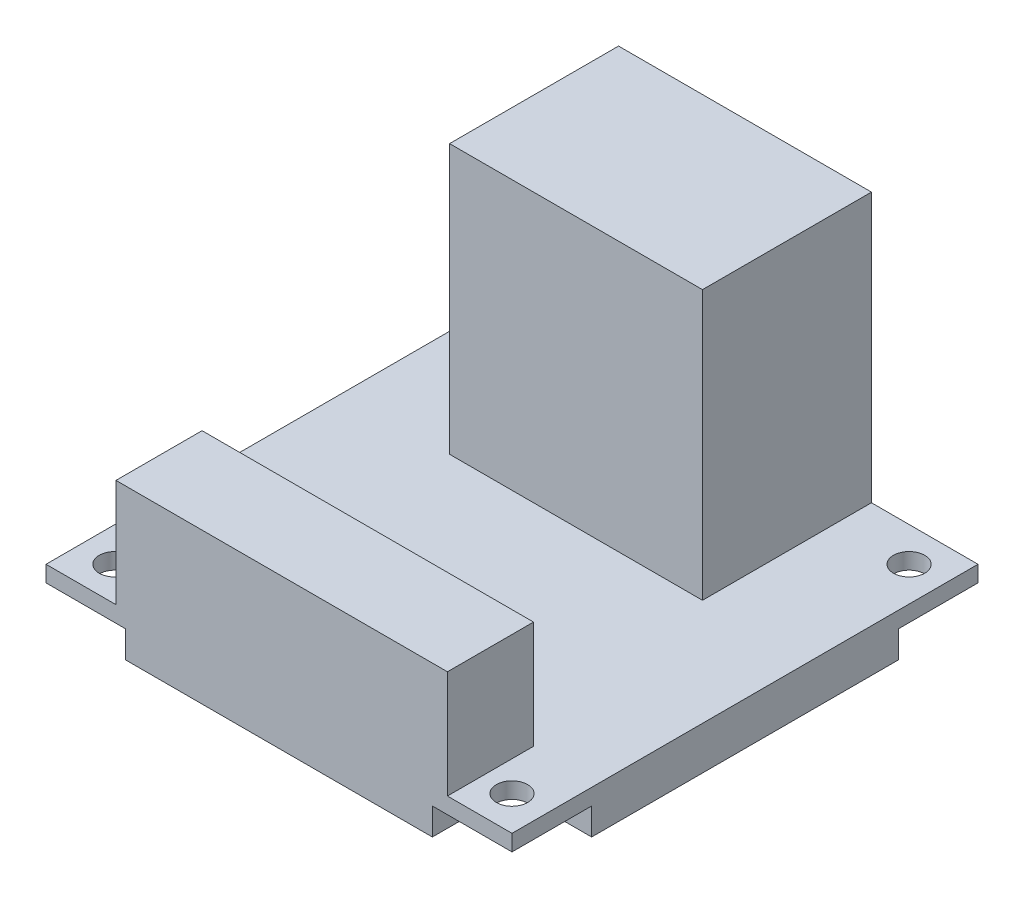
ISO-10303-21;
HEADER;
FILE_DESCRIPTION(('STEP AP214'),'2;1');
FILE_NAME('part.step','',(''),(''),'','','');
FILE_SCHEMA(('AUTOMOTIVE_DESIGN { 1 0 10303 214 1 1 1 1 }'));
ENDSEC;
DATA;
#1=APPLICATION_CONTEXT('core data for automotive mechanical design processes');
#2=APPLICATION_PROTOCOL_DEFINITION('international standard','automotive_design',2000,#1);
#3=PRODUCT_CONTEXT('',#1,'mechanical');
#4=PRODUCT('Part','Part','',(#3));
#5=PRODUCT_RELATED_PRODUCT_CATEGORY('part','',(#4));
#6=PRODUCT_DEFINITION_FORMATION('','',#4);
#7=PRODUCT_DEFINITION_CONTEXT('part definition',#1,'design');
#8=PRODUCT_DEFINITION('design','',#6,#7);
#9=PRODUCT_DEFINITION_SHAPE('','',#8);
#10=(LENGTH_UNIT() NAMED_UNIT(*) SI_UNIT(.MILLI.,.METRE.));
#11=(NAMED_UNIT(*) PLANE_ANGLE_UNIT() SI_UNIT($,.RADIAN.));
#12=(NAMED_UNIT(*) SI_UNIT($,.STERADIAN.) SOLID_ANGLE_UNIT());
#13=UNCERTAINTY_MEASURE_WITH_UNIT(LENGTH_MEASURE(1.E-05),#10,'distance_accuracy_value','');
#14=(GEOMETRIC_REPRESENTATION_CONTEXT(3) GLOBAL_UNCERTAINTY_ASSIGNED_CONTEXT((#13)) GLOBAL_UNIT_ASSIGNED_CONTEXT((#10,
#11,#12)) REPRESENTATION_CONTEXT('',''));
#15=CARTESIAN_POINT('',(0.,0.,0.));
#16=DIRECTION('',(0.,0.,1.));
#17=DIRECTION('',(1.,0.,0.));
#18=AXIS2_PLACEMENT_3D('',#15,#16,#17);
#19=CARTESIAN_POINT('',(0.,1.5,0.));
#20=DIRECTION('',(0.,-1.,0.));
#21=DIRECTION('',(0.,0.,-1.));
#22=AXIS2_PLACEMENT_3D('',#19,#20,#21);
#23=PLANE('',#22);
#24=CARTESIAN_POINT('',(3.2,1.5,-3.2));
#25=DIRECTION('',(0.,1.,0.));
#26=DIRECTION('',(0.,0.,1.));
#27=AXIS2_PLACEMENT_3D('',#24,#25,#26);
#28=CIRCLE('',#27,1.45);
#29=CARTESIAN_POINT('',(3.2,1.5,-1.75));
#30=VERTEX_POINT('',#29);
#31=EDGE_CURVE('E359',#30,#30,#28,.T.);
#32=ORIENTED_EDGE('',*,*,#31,.F.);
#33=EDGE_LOOP('',(#32));
#34=FACE_BOUND('',#33,.T.);
#35=CARTESIAN_POINT('',(3.2,1.5,-40.1));
#36=DIRECTION('',(0.,1.,0.));
#37=DIRECTION('',(0.,0.,1.));
#38=AXIS2_PLACEMENT_3D('',#35,#36,#37);
#39=CIRCLE('',#38,1.45);
#40=CARTESIAN_POINT('',(3.2,1.5,-38.65));
#41=VERTEX_POINT('',#40);
#42=EDGE_CURVE('E353',#41,#41,#39,.T.);
#43=ORIENTED_EDGE('',*,*,#42,.F.);
#44=EDGE_LOOP('',(#43));
#45=FACE_BOUND('',#44,.T.);
#46=CARTESIAN_POINT('',(40.1,1.5,-40.1));
#47=DIRECTION('',(0.,1.,0.));
#48=DIRECTION('',(0.,0.,1.));
#49=AXIS2_PLACEMENT_3D('',#46,#47,#48);
#50=CIRCLE('',#49,1.45);
#51=CARTESIAN_POINT('',(40.1,1.5,-38.65));
#52=VERTEX_POINT('',#51);
#53=EDGE_CURVE('E347',#52,#52,#50,.T.);
#54=ORIENTED_EDGE('',*,*,#53,.F.);
#55=EDGE_LOOP('',(#54));
#56=FACE_BOUND('',#55,.T.);
#57=CARTESIAN_POINT('',(40.1,1.5,-3.2));
#58=DIRECTION('',(0.,1.,0.));
#59=DIRECTION('',(0.,0.,1.));
#60=AXIS2_PLACEMENT_3D('',#57,#58,#59);
#61=CIRCLE('',#60,1.45);
#62=CARTESIAN_POINT('',(40.1,1.5,-1.75));
#63=VERTEX_POINT('',#62);
#64=EDGE_CURVE('E341',#63,#63,#61,.T.);
#65=ORIENTED_EDGE('',*,*,#64,.F.);
#66=EDGE_LOOP('',(#65));
#67=FACE_BOUND('',#66,.T.);
#68=DIRECTION('',(0.,0.,-1.));
#69=VECTOR('',#68,1.);
#70=CARTESIAN_POINT('',(33.4,1.5,-43.3));
#71=LINE('',#70,#69);
#72=CARTESIAN_POINT('',(33.4,1.5,-27.6));
#73=VERTEX_POINT('',#72);
#74=CARTESIAN_POINT('',(33.4,1.5,-43.3));
#75=VERTEX_POINT('',#74);
#76=EDGE_CURVE('E52',#73,#75,#71,.T.);
#77=ORIENTED_EDGE('',*,*,#76,.F.);
#78=DIRECTION('',(1.,0.,0.));
#79=VECTOR('',#78,1.);
#80=CARTESIAN_POINT('',(33.4,1.5,-27.6));
#81=LINE('',#80,#79);
#82=CARTESIAN_POINT('',(9.9,1.5,-27.6));
#83=VERTEX_POINT('',#82);
#84=EDGE_CURVE('E56',#83,#73,#81,.T.);
#85=ORIENTED_EDGE('',*,*,#84,.F.);
#86=DIRECTION('',(0.,0.,1.));
#87=VECTOR('',#86,1.);
#88=CARTESIAN_POINT('',(9.9,1.5,-43.3));
#89=LINE('',#88,#87);
#90=CARTESIAN_POINT('',(9.9,1.5,-43.3));
#91=VERTEX_POINT('',#90);
#92=EDGE_CURVE('E508',#91,#83,#89,.T.);
#93=ORIENTED_EDGE('',*,*,#92,.F.);
#94=DIRECTION('',(-1.,0.,0.));
#95=VECTOR('',#94,1.);
#96=CARTESIAN_POINT('',(0.,1.5,-43.3));
#97=LINE('',#96,#95);
#98=CARTESIAN_POINT('',(0.,1.5,-43.3));
#99=VERTEX_POINT('',#98);
#100=EDGE_CURVE('E374',#91,#99,#97,.T.);
#101=ORIENTED_EDGE('',*,*,#100,.T.);
#102=DIRECTION('',(0.,0.,1.));
#103=VECTOR('',#102,1.);
#104=CARTESIAN_POINT('',(0.,1.5,0.));
#105=LINE('',#104,#103);
#106=CARTESIAN_POINT('',(0.,1.5,0.));
#107=VERTEX_POINT('',#106);
#108=EDGE_CURVE('E365',#99,#107,#105,.T.);
#109=ORIENTED_EDGE('',*,*,#108,.T.);
#110=DIRECTION('',(1.,0.,0.));
#111=VECTOR('',#110,1.);
#112=CARTESIAN_POINT('',(0.,1.5,0.));
#113=LINE('',#112,#111);
#114=CARTESIAN_POINT('',(6.5,1.5,0.));
#115=VERTEX_POINT('',#114);
#116=EDGE_CURVE('E370',#107,#115,#113,.T.);
#117=ORIENTED_EDGE('',*,*,#116,.T.);
#118=DIRECTION('',(0.,0.,1.));
#119=VECTOR('',#118,1.);
#120=CARTESIAN_POINT('',(6.5,1.5,0.));
#121=LINE('',#120,#119);
#122=CARTESIAN_POINT('',(6.5,1.5,-8.));
#123=VERTEX_POINT('',#122);
#124=EDGE_CURVE('E220',#123,#115,#121,.T.);
#125=ORIENTED_EDGE('',*,*,#124,.F.);
#126=DIRECTION('',(-1.,0.,0.));
#127=VECTOR('',#126,1.);
#128=CARTESIAN_POINT('',(6.5,1.5,-8.));
#129=LINE('',#128,#127);
#130=CARTESIAN_POINT('',(37.3,1.5,-8.));
#131=VERTEX_POINT('',#130);
#132=EDGE_CURVE('E233',#131,#123,#129,.T.);
#133=ORIENTED_EDGE('',*,*,#132,.F.);
#134=DIRECTION('',(0.,0.,-1.));
#135=VECTOR('',#134,1.);
#136=CARTESIAN_POINT('',(37.3,1.5,0.));
#137=LINE('',#136,#135);
#138=CARTESIAN_POINT('',(37.3,1.5,0.));
#139=VERTEX_POINT('',#138);
#140=EDGE_CURVE('E223',#139,#131,#137,.T.);
#141=ORIENTED_EDGE('',*,*,#140,.F.);
#142=CARTESIAN_POINT('',(43.3,1.5,0.));
#143=VERTEX_POINT('',#142);
#144=EDGE_CURVE('E368',#139,#143,#113,.T.);
#145=ORIENTED_EDGE('',*,*,#144,.T.);
#146=DIRECTION('',(0.,0.,-1.));
#147=VECTOR('',#146,1.);
#148=CARTESIAN_POINT('',(43.3,1.5,0.));
#149=LINE('',#148,#147);
#150=CARTESIAN_POINT('',(43.3,1.5,-43.3));
#151=VERTEX_POINT('',#150);
#152=EDGE_CURVE('E372',#143,#151,#149,.T.);
#153=ORIENTED_EDGE('',*,*,#152,.T.);
#154=EDGE_CURVE('E375',#151,#75,#97,.T.);
#155=ORIENTED_EDGE('',*,*,#154,.T.);
#156=EDGE_LOOP('',(#77,#85,#93,#101,#109,#117,#125,#133,#141,#145,#153,#155));
#157=FACE_BOUND('',#156,.T.);
#158=ADVANCED_FACE('F37',(#34,#45,#56,#67,#157),#23,.F.);
#159=CARTESIAN_POINT('',(0.,0.,0.));
#160=DIRECTION('',(0.,-1.,0.));
#161=DIRECTION('',(0.,0.,-1.));
#162=AXIS2_PLACEMENT_3D('',#159,#160,#161);
#163=PLANE('',#162);
#164=DIRECTION('',(-1.,0.,0.));
#165=VECTOR('',#164,1.);
#166=CARTESIAN_POINT('',(0.,0.,-7.4));
#167=LINE('',#166,#165);
#168=CARTESIAN_POINT('',(7.4,0.,-7.4));
#169=VERTEX_POINT('',#168);
#170=CARTESIAN_POINT('',(0.,0.,-7.4));
#171=VERTEX_POINT('',#170);
#172=EDGE_CURVE('E260',#169,#171,#167,.T.);
#173=ORIENTED_EDGE('',*,*,#172,.F.);
#174=DIRECTION('',(0.,0.,-1.));
#175=VECTOR('',#174,1.);
#176=CARTESIAN_POINT('',(7.4,0.,-7.4));
#177=LINE('',#176,#175);
#178=CARTESIAN_POINT('',(7.4,0.,0.));
#179=VERTEX_POINT('',#178);
#180=EDGE_CURVE('E300',#179,#169,#177,.T.);
#181=ORIENTED_EDGE('',*,*,#180,.F.);
#182=DIRECTION('',(1.,0.,0.));
#183=VECTOR('',#182,1.);
#184=CARTESIAN_POINT('',(0.,0.,0.));
#185=LINE('',#184,#183);
#186=CARTESIAN_POINT('',(0.,0.,0.));
#187=VERTEX_POINT('',#186);
#188=EDGE_CURVE('E382',#187,#179,#185,.T.);
#189=ORIENTED_EDGE('',*,*,#188,.F.);
#190=DIRECTION('',(0.,0.,1.));
#191=VECTOR('',#190,1.);
#192=CARTESIAN_POINT('',(0.,0.,0.));
#193=LINE('',#192,#191);
#194=EDGE_CURVE('E362',#171,#187,#193,.T.);
#195=ORIENTED_EDGE('',*,*,#194,.F.);
#196=EDGE_LOOP('',(#173,#181,#189,#195));
#197=FACE_BOUND('',#196,.T.);
#198=CARTESIAN_POINT('',(3.2,0.,-3.2));
#199=DIRECTION('',(0.,1.,0.));
#200=DIRECTION('',(0.,0.,1.));
#201=AXIS2_PLACEMENT_3D('',#198,#199,#200);
#202=CIRCLE('',#201,1.45);
#203=CARTESIAN_POINT('',(3.2,0.,-1.75));
#204=VERTEX_POINT('',#203);
#205=EDGE_CURVE('E356',#204,#204,#202,.T.);
#206=ORIENTED_EDGE('',*,*,#205,.T.);
#207=EDGE_LOOP('',(#206));
#208=FACE_BOUND('',#207,.T.);
#209=ADVANCED_FACE('F460',(#197,#208),#163,.T.);
#210=DIRECTION('',(0.,0.,1.));
#211=VECTOR('',#210,1.);
#212=CARTESIAN_POINT('',(35.9,0.,0.));
#213=LINE('',#212,#211);
#214=CARTESIAN_POINT('',(35.9,0.,-7.4));
#215=VERTEX_POINT('',#214);
#216=CARTESIAN_POINT('',(35.9,0.,0.));
#217=VERTEX_POINT('',#216);
#218=EDGE_CURVE('E297',#215,#217,#213,.T.);
#219=ORIENTED_EDGE('',*,*,#218,.F.);
#220=DIRECTION('',(-1.,0.,0.));
#221=VECTOR('',#220,1.);
#222=CARTESIAN_POINT('',(35.9,0.,-7.4));
#223=LINE('',#222,#221);
#224=CARTESIAN_POINT('',(43.3,0.,-7.4));
#225=VERTEX_POINT('',#224);
#226=EDGE_CURVE('E294',#225,#215,#223,.T.);
#227=ORIENTED_EDGE('',*,*,#226,.F.);
#228=DIRECTION('',(0.,0.,-1.));
#229=VECTOR('',#228,1.);
#230=CARTESIAN_POINT('',(43.3,0.,0.));
#231=LINE('',#230,#229);
#232=CARTESIAN_POINT('',(43.3,0.,0.));
#233=VERTEX_POINT('',#232);
#234=EDGE_CURVE('E386',#233,#225,#231,.T.);
#235=ORIENTED_EDGE('',*,*,#234,.F.);
#236=EDGE_CURVE('E381',#217,#233,#185,.T.);
#237=ORIENTED_EDGE('',*,*,#236,.F.);
#238=EDGE_LOOP('',(#219,#227,#235,#237));
#239=FACE_BOUND('',#238,.T.);
#240=CARTESIAN_POINT('',(40.1,0.,-3.2));
#241=DIRECTION('',(0.,1.,0.));
#242=DIRECTION('',(0.,0.,1.));
#243=AXIS2_PLACEMENT_3D('',#240,#241,#242);
#244=CIRCLE('',#243,1.45);
#245=CARTESIAN_POINT('',(40.1,0.,-1.75));
#246=VERTEX_POINT('',#245);
#247=EDGE_CURVE('E340',#246,#246,#244,.T.);
#248=ORIENTED_EDGE('',*,*,#247,.T.);
#249=EDGE_LOOP('',(#248));
#250=FACE_BOUND('',#249,.T.);
#251=ADVANCED_FACE('F406',(#239,#250),#163,.T.);
#252=DIRECTION('',(1.,0.,0.));
#253=VECTOR('',#252,1.);
#254=CARTESIAN_POINT('',(43.3,0.,-35.9));
#255=LINE('',#254,#253);
#256=CARTESIAN_POINT('',(35.9,0.,-35.9));
#257=VERTEX_POINT('',#256);
#258=CARTESIAN_POINT('',(43.3,0.,-35.9));
#259=VERTEX_POINT('',#258);
#260=EDGE_CURVE('E291',#257,#259,#255,.T.);
#261=ORIENTED_EDGE('',*,*,#260,.F.);
#262=DIRECTION('',(0.,0.,1.));
#263=VECTOR('',#262,1.);
#264=CARTESIAN_POINT('',(35.9,0.,-35.9));
#265=LINE('',#264,#263);
#266=CARTESIAN_POINT('',(35.9,0.,-43.3));
#267=VERTEX_POINT('',#266);
#268=EDGE_CURVE('E288',#267,#257,#265,.T.);
#269=ORIENTED_EDGE('',*,*,#268,.F.);
#270=DIRECTION('',(-1.,0.,0.));
#271=VECTOR('',#270,1.);
#272=CARTESIAN_POINT('',(0.,0.,-43.3));
#273=LINE('',#272,#271);
#274=CARTESIAN_POINT('',(43.3,0.,-43.3));
#275=VERTEX_POINT('',#274);
#276=EDGE_CURVE('E369',#275,#267,#273,.T.);
#277=ORIENTED_EDGE('',*,*,#276,.F.);
#278=EDGE_CURVE('E385',#259,#275,#231,.T.);
#279=ORIENTED_EDGE('',*,*,#278,.F.);
#280=EDGE_LOOP('',(#261,#269,#277,#279));
#281=FACE_BOUND('',#280,.T.);
#282=CARTESIAN_POINT('',(40.1,0.,-40.1));
#283=DIRECTION('',(0.,1.,0.));
#284=DIRECTION('',(0.,0.,1.));
#285=AXIS2_PLACEMENT_3D('',#282,#283,#284);
#286=CIRCLE('',#285,1.45);
#287=CARTESIAN_POINT('',(40.1,0.,-38.65));
#288=VERTEX_POINT('',#287);
#289=EDGE_CURVE('E344',#288,#288,#286,.T.);
#290=ORIENTED_EDGE('',*,*,#289,.T.);
#291=EDGE_LOOP('',(#290));
#292=FACE_BOUND('',#291,.T.);
#293=ADVANCED_FACE('F427',(#281,#292),#163,.T.);
#294=DIRECTION('',(1.,0.,0.));
#295=VECTOR('',#294,1.);
#296=CARTESIAN_POINT('',(7.4,0.,-35.9));
#297=LINE('',#296,#295);
#298=CARTESIAN_POINT('',(0.,0.,-35.9));
#299=VERTEX_POINT('',#298);
#300=CARTESIAN_POINT('',(7.4,0.,-35.9));
#301=VERTEX_POINT('',#300);
#302=EDGE_CURVE('E255',#299,#301,#297,.T.);
#303=ORIENTED_EDGE('',*,*,#302,.F.);
#304=CARTESIAN_POINT('',(0.,0.,-43.3));
#305=VERTEX_POINT('',#304);
#306=EDGE_CURVE('E378',#305,#299,#193,.T.);
#307=ORIENTED_EDGE('',*,*,#306,.F.);
#308=CARTESIAN_POINT('',(7.4,0.,-43.3));
#309=VERTEX_POINT('',#308);
#310=EDGE_CURVE('E389',#309,#305,#273,.T.);
#311=ORIENTED_EDGE('',*,*,#310,.F.);
#312=DIRECTION('',(0.,0.,-1.));
#313=VECTOR('',#312,1.);
#314=CARTESIAN_POINT('',(7.4,0.,-43.3));
#315=LINE('',#314,#313);
#316=EDGE_CURVE('E285',#301,#309,#315,.T.);
#317=ORIENTED_EDGE('',*,*,#316,.F.);
#318=EDGE_LOOP('',(#303,#307,#311,#317));
#319=FACE_BOUND('',#318,.T.);
#320=CARTESIAN_POINT('',(3.2,0.,-40.1));
#321=DIRECTION('',(0.,1.,0.));
#322=DIRECTION('',(0.,0.,1.));
#323=AXIS2_PLACEMENT_3D('',#320,#321,#322);
#324=CIRCLE('',#323,1.45);
#325=CARTESIAN_POINT('',(3.2,0.,-38.65));
#326=VERTEX_POINT('',#325);
#327=EDGE_CURVE('E350',#326,#326,#324,.T.);
#328=ORIENTED_EDGE('',*,*,#327,.T.);
#329=EDGE_LOOP('',(#328));
#330=FACE_BOUND('',#329,.T.);
#331=ADVANCED_FACE('F468',(#319,#330),#163,.T.);
#332=CARTESIAN_POINT('',(0.,1.5,0.));
#333=DIRECTION('',(1.,0.,0.));
#334=DIRECTION('',(0.,0.,-1.));
#335=AXIS2_PLACEMENT_3D('',#332,#333,#334);
#336=PLANE('',#335);
#337=ORIENTED_EDGE('',*,*,#306,.T.);
#338=DIRECTION('',(0.,1.,0.));
#339=VECTOR('',#338,1.);
#340=CARTESIAN_POINT('',(0.,-2.5,-35.9));
#341=LINE('',#340,#339);
#342=CARTESIAN_POINT('',(0.,-2.5,-35.9));
#343=VERTEX_POINT('',#342);
#344=EDGE_CURVE('E282',#343,#299,#341,.T.);
#345=ORIENTED_EDGE('',*,*,#344,.F.);
#346=DIRECTION('',(0.,0.,-1.));
#347=VECTOR('',#346,1.);
#348=CARTESIAN_POINT('',(0.,-2.5,-35.9));
#349=LINE('',#348,#347);
#350=CARTESIAN_POINT('',(0.,-2.5,-7.4));
#351=VERTEX_POINT('',#350);
#352=EDGE_CURVE('E280',#351,#343,#349,.T.);
#353=ORIENTED_EDGE('',*,*,#352,.F.);
#354=DIRECTION('',(0.,1.,0.));
#355=VECTOR('',#354,1.);
#356=CARTESIAN_POINT('',(0.,-2.5,-7.4));
#357=LINE('',#356,#355);
#358=EDGE_CURVE('E307',#351,#171,#357,.T.);
#359=ORIENTED_EDGE('',*,*,#358,.T.);
#360=ORIENTED_EDGE('',*,*,#194,.T.);
#361=DIRECTION('',(0.,-1.,0.));
#362=VECTOR('',#361,1.);
#363=CARTESIAN_POINT('',(0.,1.5,0.));
#364=LINE('',#363,#362);
#365=EDGE_CURVE('E11',#107,#187,#364,.T.);
#366=ORIENTED_EDGE('',*,*,#365,.F.);
#367=ORIENTED_EDGE('',*,*,#108,.F.);
#368=DIRECTION('',(0.,-1.,0.));
#369=VECTOR('',#368,1.);
#370=CARTESIAN_POINT('',(0.,1.5,-43.3));
#371=LINE('',#370,#369);
#372=EDGE_CURVE('E377',#99,#305,#371,.T.);
#373=ORIENTED_EDGE('',*,*,#372,.T.);
#374=EDGE_LOOP('',(#337,#345,#353,#359,#360,#366,#367,#373));
#375=FACE_BOUND('',#374,.T.);
#376=ADVANCED_FACE('F39',(#375),#336,.F.);
#377=CARTESIAN_POINT('',(0.,1.5,0.));
#378=DIRECTION('',(0.,0.,-1.));
#379=DIRECTION('',(-1.,0.,0.));
#380=AXIS2_PLACEMENT_3D('',#377,#378,#379);
#381=PLANE('',#380);
#382=ORIENTED_EDGE('',*,*,#188,.T.);
#383=DIRECTION('',(0.,1.,0.));
#384=VECTOR('',#383,1.);
#385=CARTESIAN_POINT('',(7.4,-2.5,0.));
#386=LINE('',#385,#384);
#387=CARTESIAN_POINT('',(7.4,-2.5,0.));
#388=VERTEX_POINT('',#387);
#389=EDGE_CURVE('E313',#388,#179,#386,.T.);
#390=ORIENTED_EDGE('',*,*,#389,.F.);
#391=DIRECTION('',(-1.,0.,0.));
#392=VECTOR('',#391,1.);
#393=CARTESIAN_POINT('',(7.4,-2.5,0.));
#394=LINE('',#393,#392);
#395=CARTESIAN_POINT('',(35.9,-2.5,0.));
#396=VERTEX_POINT('',#395);
#397=EDGE_CURVE('E274',#396,#388,#394,.T.);
#398=ORIENTED_EDGE('',*,*,#397,.F.);
#399=DIRECTION('',(0.,1.,0.));
#400=VECTOR('',#399,1.);
#401=CARTESIAN_POINT('',(35.9,-2.5,0.));
#402=LINE('',#401,#400);
#403=EDGE_CURVE('E316',#396,#217,#402,.T.);
#404=ORIENTED_EDGE('',*,*,#403,.T.);
#405=ORIENTED_EDGE('',*,*,#236,.T.);
#406=DIRECTION('',(0.,-1.,0.));
#407=VECTOR('',#406,1.);
#408=CARTESIAN_POINT('',(43.3,1.5,0.));
#409=LINE('',#408,#407);
#410=EDGE_CURVE('E45',#143,#233,#409,.T.);
#411=ORIENTED_EDGE('',*,*,#410,.F.);
#412=ORIENTED_EDGE('',*,*,#144,.F.);
#413=DIRECTION('',(0.,-1.,0.));
#414=VECTOR('',#413,1.);
#415=CARTESIAN_POINT('',(37.3,11.5,0.));
#416=LINE('',#415,#414);
#417=CARTESIAN_POINT('',(37.3,11.5,0.));
#418=VERTEX_POINT('',#417);
#419=EDGE_CURVE('E249',#418,#139,#416,.T.);
#420=ORIENTED_EDGE('',*,*,#419,.F.);
#421=DIRECTION('',(1.,0.,0.));
#422=VECTOR('',#421,1.);
#423=CARTESIAN_POINT('',(6.5,11.5,0.));
#424=LINE('',#423,#422);
#425=CARTESIAN_POINT('',(6.5,11.5,0.));
#426=VERTEX_POINT('',#425);
#427=EDGE_CURVE('E232',#426,#418,#424,.T.);
#428=ORIENTED_EDGE('',*,*,#427,.F.);
#429=DIRECTION('',(0.,-1.,0.));
#430=VECTOR('',#429,1.);
#431=CARTESIAN_POINT('',(6.5,11.5,0.));
#432=LINE('',#431,#430);
#433=EDGE_CURVE('E252',#426,#115,#432,.T.);
#434=ORIENTED_EDGE('',*,*,#433,.T.);
#435=ORIENTED_EDGE('',*,*,#116,.F.);
#436=ORIENTED_EDGE('',*,*,#365,.T.);
#437=EDGE_LOOP('',(#382,#390,#398,#404,#405,#411,#412,#420,#428,#434,#435,#436));
#438=FACE_BOUND('',#437,.T.);
#439=ADVANCED_FACE('F436',(#438),#381,.F.);
#440=CARTESIAN_POINT('',(43.3,1.5,0.));
#441=DIRECTION('',(-1.,0.,0.));
#442=DIRECTION('',(0.,0.,1.));
#443=AXIS2_PLACEMENT_3D('',#440,#441,#442);
#444=PLANE('',#443);
#445=ORIENTED_EDGE('',*,*,#234,.T.);
#446=DIRECTION('',(0.,1.,0.));
#447=VECTOR('',#446,1.);
#448=CARTESIAN_POINT('',(43.3,-2.5,-7.4));
#449=LINE('',#448,#447);
#450=CARTESIAN_POINT('',(43.3,-2.5,-7.4));
#451=VERTEX_POINT('',#450);
#452=EDGE_CURVE('E322',#451,#225,#449,.T.);
#453=ORIENTED_EDGE('',*,*,#452,.F.);
#454=DIRECTION('',(0.,0.,1.));
#455=VECTOR('',#454,1.);
#456=CARTESIAN_POINT('',(43.3,-2.5,-7.4));
#457=LINE('',#456,#455);
#458=CARTESIAN_POINT('',(43.3,-2.5,-35.9));
#459=VERTEX_POINT('',#458);
#460=EDGE_CURVE('E268',#459,#451,#457,.T.);
#461=ORIENTED_EDGE('',*,*,#460,.F.);
#462=DIRECTION('',(0.,1.,0.));
#463=VECTOR('',#462,1.);
#464=CARTESIAN_POINT('',(43.3,-2.5,-35.9));
#465=LINE('',#464,#463);
#466=EDGE_CURVE('E325',#459,#259,#465,.T.);
#467=ORIENTED_EDGE('',*,*,#466,.T.);
#468=ORIENTED_EDGE('',*,*,#278,.T.);
#469=DIRECTION('',(0.,-1.,0.));
#470=VECTOR('',#469,1.);
#471=CARTESIAN_POINT('',(43.3,1.5,-43.3));
#472=LINE('',#471,#470);
#473=EDGE_CURVE('E393',#151,#275,#472,.T.);
#474=ORIENTED_EDGE('',*,*,#473,.F.);
#475=ORIENTED_EDGE('',*,*,#152,.F.);
#476=ORIENTED_EDGE('',*,*,#410,.T.);
#477=EDGE_LOOP('',(#445,#453,#461,#467,#468,#474,#475,#476));
#478=FACE_BOUND('',#477,.T.);
#479=ADVANCED_FACE('F400',(#478),#444,.F.);
#480=CARTESIAN_POINT('',(0.,1.5,-43.3));
#481=DIRECTION('',(0.,0.,1.));
#482=DIRECTION('',(1.,0.,0.));
#483=AXIS2_PLACEMENT_3D('',#480,#481,#482);
#484=PLANE('',#483);
#485=ORIENTED_EDGE('',*,*,#276,.T.);
#486=DIRECTION('',(0.,1.,0.));
#487=VECTOR('',#486,1.);
#488=CARTESIAN_POINT('',(35.9,-2.5,-43.3));
#489=LINE('',#488,#487);
#490=CARTESIAN_POINT('',(35.9,-2.5,-43.3));
#491=VERTEX_POINT('',#490);
#492=EDGE_CURVE('E331',#491,#267,#489,.T.);
#493=ORIENTED_EDGE('',*,*,#492,.F.);
#494=DIRECTION('',(1.,0.,0.));
#495=VECTOR('',#494,1.);
#496=CARTESIAN_POINT('',(35.9,-2.5,-43.3));
#497=LINE('',#496,#495);
#498=CARTESIAN_POINT('',(7.4,-2.5,-43.3));
#499=VERTEX_POINT('',#498);
#500=EDGE_CURVE('E262',#499,#491,#497,.T.);
#501=ORIENTED_EDGE('',*,*,#500,.F.);
#502=DIRECTION('',(0.,1.,0.));
#503=VECTOR('',#502,1.);
#504=CARTESIAN_POINT('',(7.4,-2.5,-43.3));
#505=LINE('',#504,#503);
#506=EDGE_CURVE('E334',#499,#309,#505,.T.);
#507=ORIENTED_EDGE('',*,*,#506,.T.);
#508=ORIENTED_EDGE('',*,*,#310,.T.);
#509=ORIENTED_EDGE('',*,*,#372,.F.);
#510=ORIENTED_EDGE('',*,*,#100,.F.);
#511=DIRECTION('',(0.,-1.,0.));
#512=VECTOR('',#511,1.);
#513=CARTESIAN_POINT('',(9.9,26.5,-43.3));
#514=LINE('',#513,#512);
#515=CARTESIAN_POINT('',(9.9,26.5,-43.3));
#516=VERTEX_POINT('',#515);
#517=EDGE_CURVE('E205',#516,#91,#514,.T.);
#518=ORIENTED_EDGE('',*,*,#517,.F.);
#519=DIRECTION('',(-1.,0.,0.));
#520=VECTOR('',#519,1.);
#521=CARTESIAN_POINT('',(33.4,26.5,-43.3));
#522=LINE('',#521,#520);
#523=CARTESIAN_POINT('',(33.4,26.5,-43.3));
#524=VERTEX_POINT('',#523);
#525=EDGE_CURVE('E197',#524,#516,#522,.T.);
#526=ORIENTED_EDGE('',*,*,#525,.F.);
#527=DIRECTION('',(0.,-1.,0.));
#528=VECTOR('',#527,1.);
#529=CARTESIAN_POINT('',(33.4,26.5,-43.3));
#530=LINE('',#529,#528);
#531=EDGE_CURVE('E203',#524,#75,#530,.T.);
#532=ORIENTED_EDGE('',*,*,#531,.T.);
#533=ORIENTED_EDGE('',*,*,#154,.F.);
#534=ORIENTED_EDGE('',*,*,#473,.T.);
#535=EDGE_LOOP('',(#485,#493,#501,#507,#508,#509,#510,#518,#526,#532,#533,#534));
#536=FACE_BOUND('',#535,.T.);
#537=ADVANCED_FACE('F200',(#536),#484,.F.);
#538=CARTESIAN_POINT('',(3.2,1.5,-3.2));
#539=DIRECTION('',(0.,-1.,0.));
#540=DIRECTION('',(0.,0.,-1.));
#541=AXIS2_PLACEMENT_3D('',#538,#539,#540);
#542=CYLINDRICAL_SURFACE('',#541,1.45);
#543=ORIENTED_EDGE('',*,*,#31,.T.);
#544=EDGE_LOOP('',(#543));
#545=FACE_BOUND('',#544,.T.);
#546=ORIENTED_EDGE('',*,*,#205,.F.);
#547=EDGE_LOOP('',(#546));
#548=FACE_BOUND('',#547,.T.);
#549=ADVANCED_FACE('F472',(#545,#548),#542,.F.);
#550=CARTESIAN_POINT('',(3.2,1.5,-40.1));
#551=DIRECTION('',(0.,-1.,0.));
#552=DIRECTION('',(0.,0.,-1.));
#553=AXIS2_PLACEMENT_3D('',#550,#551,#552);
#554=CYLINDRICAL_SURFACE('',#553,1.45);
#555=ORIENTED_EDGE('',*,*,#42,.T.);
#556=EDGE_LOOP('',(#555));
#557=FACE_BOUND('',#556,.T.);
#558=ORIENTED_EDGE('',*,*,#327,.F.);
#559=EDGE_LOOP('',(#558));
#560=FACE_BOUND('',#559,.T.);
#561=ADVANCED_FACE('F528',(#557,#560),#554,.F.);
#562=CARTESIAN_POINT('',(40.1,1.5,-40.1));
#563=DIRECTION('',(0.,-1.,0.));
#564=DIRECTION('',(0.,0.,-1.));
#565=AXIS2_PLACEMENT_3D('',#562,#563,#564);
#566=CYLINDRICAL_SURFACE('',#565,1.45);
#567=ORIENTED_EDGE('',*,*,#53,.T.);
#568=EDGE_LOOP('',(#567));
#569=FACE_BOUND('',#568,.T.);
#570=ORIENTED_EDGE('',*,*,#289,.F.);
#571=EDGE_LOOP('',(#570));
#572=FACE_BOUND('',#571,.T.);
#573=ADVANCED_FACE('F525',(#569,#572),#566,.F.);
#574=CARTESIAN_POINT('',(40.1,1.5,-3.2));
#575=DIRECTION('',(0.,-1.,0.));
#576=DIRECTION('',(0.,0.,-1.));
#577=AXIS2_PLACEMENT_3D('',#574,#575,#576);
#578=CYLINDRICAL_SURFACE('',#577,1.45);
#579=ORIENTED_EDGE('',*,*,#64,.T.);
#580=EDGE_LOOP('',(#579));
#581=FACE_BOUND('',#580,.T.);
#582=ORIENTED_EDGE('',*,*,#247,.F.);
#583=EDGE_LOOP('',(#582));
#584=FACE_BOUND('',#583,.T.);
#585=ADVANCED_FACE('F519',(#581,#584),#578,.F.);
#586=CARTESIAN_POINT('',(7.4,-2.5,-35.9));
#587=DIRECTION('',(0.,0.,1.));
#588=DIRECTION('',(1.,0.,0.));
#589=AXIS2_PLACEMENT_3D('',#586,#587,#588);
#590=PLANE('',#589);
#591=ORIENTED_EDGE('',*,*,#302,.T.);
#592=DIRECTION('',(0.,1.,0.));
#593=VECTOR('',#592,1.);
#594=CARTESIAN_POINT('',(7.4,-2.5,-35.9));
#595=LINE('',#594,#593);
#596=CARTESIAN_POINT('',(7.4,-2.5,-35.9));
#597=VERTEX_POINT('',#596);
#598=EDGE_CURVE('E337',#597,#301,#595,.T.);
#599=ORIENTED_EDGE('',*,*,#598,.F.);
#600=DIRECTION('',(1.,0.,0.));
#601=VECTOR('',#600,1.);
#602=CARTESIAN_POINT('',(7.4,-2.5,-35.9));
#603=LINE('',#602,#601);
#604=EDGE_CURVE('E256',#343,#597,#603,.T.);
#605=ORIENTED_EDGE('',*,*,#604,.F.);
#606=ORIENTED_EDGE('',*,*,#344,.T.);
#607=EDGE_LOOP('',(#591,#599,#605,#606));
#608=FACE_BOUND('',#607,.T.);
#609=ADVANCED_FACE('F494',(#608),#590,.F.);
#610=CARTESIAN_POINT('',(7.4,-2.5,-43.3));
#611=DIRECTION('',(1.,0.,0.));
#612=DIRECTION('',(0.,0.,-1.));
#613=AXIS2_PLACEMENT_3D('',#610,#611,#612);
#614=PLANE('',#613);
#615=ORIENTED_EDGE('',*,*,#316,.T.);
#616=ORIENTED_EDGE('',*,*,#506,.F.);
#617=DIRECTION('',(0.,0.,-1.));
#618=VECTOR('',#617,1.);
#619=CARTESIAN_POINT('',(7.4,-2.5,-43.3));
#620=LINE('',#619,#618);
#621=EDGE_CURVE('E259',#597,#499,#620,.T.);
#622=ORIENTED_EDGE('',*,*,#621,.F.);
#623=ORIENTED_EDGE('',*,*,#598,.T.);
#624=EDGE_LOOP('',(#615,#616,#622,#623));
#625=FACE_BOUND('',#624,.T.);
#626=ADVANCED_FACE('F511',(#625),#614,.F.);
#627=CARTESIAN_POINT('',(35.9,-2.5,-35.9));
#628=DIRECTION('',(-1.,0.,0.));
#629=DIRECTION('',(0.,0.,1.));
#630=AXIS2_PLACEMENT_3D('',#627,#628,#629);
#631=PLANE('',#630);
#632=ORIENTED_EDGE('',*,*,#268,.T.);
#633=DIRECTION('',(0.,1.,0.));
#634=VECTOR('',#633,1.);
#635=CARTESIAN_POINT('',(35.9,-2.5,-35.9));
#636=LINE('',#635,#634);
#637=CARTESIAN_POINT('',(35.9,-2.5,-35.9));
#638=VERTEX_POINT('',#637);
#639=EDGE_CURVE('E328',#638,#257,#636,.T.);
#640=ORIENTED_EDGE('',*,*,#639,.F.);
#641=DIRECTION('',(0.,0.,1.));
#642=VECTOR('',#641,1.);
#643=CARTESIAN_POINT('',(35.9,-2.5,-35.9));
#644=LINE('',#643,#642);
#645=EDGE_CURVE('E264',#491,#638,#644,.T.);
#646=ORIENTED_EDGE('',*,*,#645,.F.);
#647=ORIENTED_EDGE('',*,*,#492,.T.);
#648=EDGE_LOOP('',(#632,#640,#646,#647));
#649=FACE_BOUND('',#648,.T.);
#650=ADVANCED_FACE('F431',(#649),#631,.F.);
#651=CARTESIAN_POINT('',(43.3,-2.5,-35.9));
#652=DIRECTION('',(0.,0.,1.));
#653=DIRECTION('',(1.,0.,0.));
#654=AXIS2_PLACEMENT_3D('',#651,#652,#653);
#655=PLANE('',#654);
#656=ORIENTED_EDGE('',*,*,#260,.T.);
#657=ORIENTED_EDGE('',*,*,#466,.F.);
#658=DIRECTION('',(1.,0.,0.));
#659=VECTOR('',#658,1.);
#660=CARTESIAN_POINT('',(43.3,-2.5,-35.9));
#661=LINE('',#660,#659);
#662=EDGE_CURVE('E266',#638,#459,#661,.T.);
#663=ORIENTED_EDGE('',*,*,#662,.F.);
#664=ORIENTED_EDGE('',*,*,#639,.T.);
#665=EDGE_LOOP('',(#656,#657,#663,#664));
#666=FACE_BOUND('',#665,.T.);
#667=ADVANCED_FACE('F424',(#666),#655,.F.);
#668=CARTESIAN_POINT('',(35.9,-2.5,-7.4));
#669=DIRECTION('',(0.,0.,-1.));
#670=DIRECTION('',(-1.,0.,0.));
#671=AXIS2_PLACEMENT_3D('',#668,#669,#670);
#672=PLANE('',#671);
#673=ORIENTED_EDGE('',*,*,#226,.T.);
#674=DIRECTION('',(0.,1.,0.));
#675=VECTOR('',#674,1.);
#676=CARTESIAN_POINT('',(35.9,-2.5,-7.4));
#677=LINE('',#676,#675);
#678=CARTESIAN_POINT('',(35.9,-2.5,-7.4));
#679=VERTEX_POINT('',#678);
#680=EDGE_CURVE('E319',#679,#215,#677,.T.);
#681=ORIENTED_EDGE('',*,*,#680,.F.);
#682=DIRECTION('',(-1.,0.,0.));
#683=VECTOR('',#682,1.);
#684=CARTESIAN_POINT('',(35.9,-2.5,-7.4));
#685=LINE('',#684,#683);
#686=EDGE_CURVE('E270',#451,#679,#685,.T.);
#687=ORIENTED_EDGE('',*,*,#686,.F.);
#688=ORIENTED_EDGE('',*,*,#452,.T.);
#689=EDGE_LOOP('',(#673,#681,#687,#688));
#690=FACE_BOUND('',#689,.T.);
#691=ADVANCED_FACE('F410',(#690),#672,.F.);
#692=CARTESIAN_POINT('',(35.9,-2.5,0.));
#693=DIRECTION('',(-1.,0.,0.));
#694=DIRECTION('',(0.,0.,1.));
#695=AXIS2_PLACEMENT_3D('',#692,#693,#694);
#696=PLANE('',#695);
#697=ORIENTED_EDGE('',*,*,#218,.T.);
#698=ORIENTED_EDGE('',*,*,#403,.F.);
#699=DIRECTION('',(0.,0.,1.));
#700=VECTOR('',#699,1.);
#701=CARTESIAN_POINT('',(35.9,-2.5,0.));
#702=LINE('',#701,#700);
#703=EDGE_CURVE('E272',#679,#396,#702,.T.);
#704=ORIENTED_EDGE('',*,*,#703,.F.);
#705=ORIENTED_EDGE('',*,*,#680,.T.);
#706=EDGE_LOOP('',(#697,#698,#704,#705));
#707=FACE_BOUND('',#706,.T.);
#708=ADVANCED_FACE('F414',(#707),#696,.F.);
#709=CARTESIAN_POINT('',(7.4,-2.5,-7.4));
#710=DIRECTION('',(1.,0.,0.));
#711=DIRECTION('',(0.,0.,-1.));
#712=AXIS2_PLACEMENT_3D('',#709,#710,#711);
#713=PLANE('',#712);
#714=ORIENTED_EDGE('',*,*,#180,.T.);
#715=DIRECTION('',(0.,1.,0.));
#716=VECTOR('',#715,1.);
#717=CARTESIAN_POINT('',(7.4,-2.5,-7.4));
#718=LINE('',#717,#716);
#719=CARTESIAN_POINT('',(7.4,-2.5,-7.4));
#720=VERTEX_POINT('',#719);
#721=EDGE_CURVE('E310',#720,#169,#718,.T.);
#722=ORIENTED_EDGE('',*,*,#721,.F.);
#723=DIRECTION('',(0.,0.,-1.));
#724=VECTOR('',#723,1.);
#725=CARTESIAN_POINT('',(7.4,-2.5,-7.4));
#726=LINE('',#725,#724);
#727=EDGE_CURVE('E276',#388,#720,#726,.T.);
#728=ORIENTED_EDGE('',*,*,#727,.F.);
#729=ORIENTED_EDGE('',*,*,#389,.T.);
#730=EDGE_LOOP('',(#714,#722,#728,#729));
#731=FACE_BOUND('',#730,.T.);
#732=ADVANCED_FACE('F506',(#731),#713,.F.);
#733=CARTESIAN_POINT('',(0.,-2.5,-7.4));
#734=DIRECTION('',(0.,0.,-1.));
#735=DIRECTION('',(-1.,0.,0.));
#736=AXIS2_PLACEMENT_3D('',#733,#734,#735);
#737=PLANE('',#736);
#738=ORIENTED_EDGE('',*,*,#172,.T.);
#739=ORIENTED_EDGE('',*,*,#358,.F.);
#740=DIRECTION('',(-1.,0.,0.));
#741=VECTOR('',#740,1.);
#742=CARTESIAN_POINT('',(0.,-2.5,-7.4));
#743=LINE('',#742,#741);
#744=EDGE_CURVE('E278',#720,#351,#743,.T.);
#745=ORIENTED_EDGE('',*,*,#744,.F.);
#746=ORIENTED_EDGE('',*,*,#721,.T.);
#747=EDGE_LOOP('',(#738,#739,#745,#746));
#748=FACE_BOUND('',#747,.T.);
#749=ADVANCED_FACE('F502',(#748),#737,.F.);
#750=CARTESIAN_POINT('',(0.,-2.5,0.));
#751=DIRECTION('',(0.,1.,0.));
#752=DIRECTION('',(0.,0.,1.));
#753=AXIS2_PLACEMENT_3D('',#750,#751,#752);
#754=PLANE('',#753);
#755=ORIENTED_EDGE('',*,*,#604,.T.);
#756=ORIENTED_EDGE('',*,*,#621,.T.);
#757=ORIENTED_EDGE('',*,*,#500,.T.);
#758=ORIENTED_EDGE('',*,*,#645,.T.);
#759=ORIENTED_EDGE('',*,*,#662,.T.);
#760=ORIENTED_EDGE('',*,*,#460,.T.);
#761=ORIENTED_EDGE('',*,*,#686,.T.);
#762=ORIENTED_EDGE('',*,*,#703,.T.);
#763=ORIENTED_EDGE('',*,*,#397,.T.);
#764=ORIENTED_EDGE('',*,*,#727,.T.);
#765=ORIENTED_EDGE('',*,*,#744,.T.);
#766=ORIENTED_EDGE('',*,*,#352,.T.);
#767=EDGE_LOOP('',(#755,#756,#757,#758,#759,#760,#761,#762,#763,#764,#765,#766));
#768=FACE_BOUND('',#767,.T.);
#769=ADVANCED_FACE('F418',(#768),#754,.F.);
#770=CARTESIAN_POINT('',(6.5,11.5,0.));
#771=DIRECTION('',(1.,0.,0.));
#772=DIRECTION('',(0.,0.,-1.));
#773=AXIS2_PLACEMENT_3D('',#770,#771,#772);
#774=PLANE('',#773);
#775=ORIENTED_EDGE('',*,*,#124,.T.);
#776=ORIENTED_EDGE('',*,*,#433,.F.);
#777=DIRECTION('',(0.,0.,1.));
#778=VECTOR('',#777,1.);
#779=CARTESIAN_POINT('',(6.5,11.5,0.));
#780=LINE('',#779,#778);
#781=CARTESIAN_POINT('',(6.5,11.5,-8.));
#782=VERTEX_POINT('',#781);
#783=EDGE_CURVE('E229',#782,#426,#780,.T.);
#784=ORIENTED_EDGE('',*,*,#783,.F.);
#785=DIRECTION('',(0.,-1.,0.));
#786=VECTOR('',#785,1.);
#787=CARTESIAN_POINT('',(6.5,11.5,-8.));
#788=LINE('',#787,#786);
#789=EDGE_CURVE('E238',#782,#123,#788,.T.);
#790=ORIENTED_EDGE('',*,*,#789,.T.);
#791=EDGE_LOOP('',(#775,#776,#784,#790));
#792=FACE_BOUND('',#791,.T.);
#793=ADVANCED_FACE('F448',(#792),#774,.F.);
#794=CARTESIAN_POINT('',(37.3,11.5,0.));
#795=DIRECTION('',(-1.,0.,0.));
#796=DIRECTION('',(0.,0.,1.));
#797=AXIS2_PLACEMENT_3D('',#794,#795,#796);
#798=PLANE('',#797);
#799=ORIENTED_EDGE('',*,*,#140,.T.);
#800=DIRECTION('',(0.,-1.,0.));
#801=VECTOR('',#800,1.);
#802=CARTESIAN_POINT('',(37.3,11.5,-8.));
#803=LINE('',#802,#801);
#804=CARTESIAN_POINT('',(37.3,11.5,-8.));
#805=VERTEX_POINT('',#804);
#806=EDGE_CURVE('E246',#805,#131,#803,.T.);
#807=ORIENTED_EDGE('',*,*,#806,.F.);
#808=DIRECTION('',(0.,0.,-1.));
#809=VECTOR('',#808,1.);
#810=CARTESIAN_POINT('',(37.3,11.5,0.));
#811=LINE('',#810,#809);
#812=EDGE_CURVE('E235',#418,#805,#811,.T.);
#813=ORIENTED_EDGE('',*,*,#812,.F.);
#814=ORIENTED_EDGE('',*,*,#419,.T.);
#815=EDGE_LOOP('',(#799,#807,#813,#814));
#816=FACE_BOUND('',#815,.T.);
#817=ADVANCED_FACE('F439',(#816),#798,.F.);
#818=CARTESIAN_POINT('',(6.5,11.5,-8.));
#819=DIRECTION('',(0.,0.,1.));
#820=DIRECTION('',(1.,0.,0.));
#821=AXIS2_PLACEMENT_3D('',#818,#819,#820);
#822=PLANE('',#821);
#823=ORIENTED_EDGE('',*,*,#132,.T.);
#824=ORIENTED_EDGE('',*,*,#789,.F.);
#825=DIRECTION('',(-1.,0.,0.));
#826=VECTOR('',#825,1.);
#827=CARTESIAN_POINT('',(6.5,11.5,-8.));
#828=LINE('',#827,#826);
#829=EDGE_CURVE('E237',#805,#782,#828,.T.);
#830=ORIENTED_EDGE('',*,*,#829,.F.);
#831=ORIENTED_EDGE('',*,*,#806,.T.);
#832=EDGE_LOOP('',(#823,#824,#830,#831));
#833=FACE_BOUND('',#832,.T.);
#834=ADVANCED_FACE('F450',(#833),#822,.F.);
#835=CARTESIAN_POINT('',(0.,11.5,0.));
#836=DIRECTION('',(0.,-1.,0.));
#837=DIRECTION('',(0.,0.,-1.));
#838=AXIS2_PLACEMENT_3D('',#835,#836,#837);
#839=PLANE('',#838);
#840=ORIENTED_EDGE('',*,*,#783,.T.);
#841=ORIENTED_EDGE('',*,*,#427,.T.);
#842=ORIENTED_EDGE('',*,*,#812,.T.);
#843=ORIENTED_EDGE('',*,*,#829,.T.);
#844=EDGE_LOOP('',(#840,#841,#842,#843));
#845=FACE_BOUND('',#844,.T.);
#846=ADVANCED_FACE('F443',(#845),#839,.F.);
#847=CARTESIAN_POINT('',(33.4,26.5,-43.3));
#848=DIRECTION('',(-1.,0.,0.));
#849=DIRECTION('',(0.,0.,1.));
#850=AXIS2_PLACEMENT_3D('',#847,#848,#849);
#851=PLANE('',#850);
#852=ORIENTED_EDGE('',*,*,#76,.T.);
#853=ORIENTED_EDGE('',*,*,#531,.F.);
#854=DIRECTION('',(0.,0.,-1.));
#855=VECTOR('',#854,1.);
#856=CARTESIAN_POINT('',(33.4,26.5,-43.3));
#857=LINE('',#856,#855);
#858=CARTESIAN_POINT('',(33.4,26.5,-27.6));
#859=VERTEX_POINT('',#858);
#860=EDGE_CURVE('E209',#859,#524,#857,.T.);
#861=ORIENTED_EDGE('',*,*,#860,.F.);
#862=DIRECTION('',(0.,-1.,0.));
#863=VECTOR('',#862,1.);
#864=CARTESIAN_POINT('',(33.4,26.5,-27.6));
#865=LINE('',#864,#863);
#866=EDGE_CURVE('E712',#859,#73,#865,.T.);
#867=ORIENTED_EDGE('',*,*,#866,.T.);
#868=EDGE_LOOP('',(#852,#853,#861,#867));
#869=FACE_BOUND('',#868,.T.);
#870=ADVANCED_FACE('F219',(#869),#851,.F.);
#871=CARTESIAN_POINT('',(9.9,26.5,-43.3));
#872=DIRECTION('',(1.,0.,0.));
#873=DIRECTION('',(0.,0.,-1.));
#874=AXIS2_PLACEMENT_3D('',#871,#872,#873);
#875=PLANE('',#874);
#876=ORIENTED_EDGE('',*,*,#92,.T.);
#877=DIRECTION('',(0.,-1.,0.));
#878=VECTOR('',#877,1.);
#879=CARTESIAN_POINT('',(9.9,26.5,-27.6));
#880=LINE('',#879,#878);
#881=CARTESIAN_POINT('',(9.9,26.5,-27.6));
#882=VERTEX_POINT('',#881);
#883=EDGE_CURVE('E225',#882,#83,#880,.T.);
#884=ORIENTED_EDGE('',*,*,#883,.F.);
#885=DIRECTION('',(0.,0.,1.));
#886=VECTOR('',#885,1.);
#887=CARTESIAN_POINT('',(9.9,26.5,-43.3));
#888=LINE('',#887,#886);
#889=EDGE_CURVE('E208',#516,#882,#888,.T.);
#890=ORIENTED_EDGE('',*,*,#889,.F.);
#891=ORIENTED_EDGE('',*,*,#517,.T.);
#892=EDGE_LOOP('',(#876,#884,#890,#891));
#893=FACE_BOUND('',#892,.T.);
#894=ADVANCED_FACE('F680',(#893),#875,.F.);
#895=CARTESIAN_POINT('',(33.4,26.5,-27.6));
#896=DIRECTION('',(0.,0.,-1.));
#897=DIRECTION('',(-1.,0.,0.));
#898=AXIS2_PLACEMENT_3D('',#895,#896,#897);
#899=PLANE('',#898);
#900=ORIENTED_EDGE('',*,*,#84,.T.);
#901=ORIENTED_EDGE('',*,*,#866,.F.);
#902=DIRECTION('',(1.,0.,0.));
#903=VECTOR('',#902,1.);
#904=CARTESIAN_POINT('',(33.4,26.5,-27.6));
#905=LINE('',#904,#903);
#906=EDGE_CURVE('E214',#882,#859,#905,.T.);
#907=ORIENTED_EDGE('',*,*,#906,.F.);
#908=ORIENTED_EDGE('',*,*,#883,.T.);
#909=EDGE_LOOP('',(#900,#901,#907,#908));
#910=FACE_BOUND('',#909,.T.);
#911=ADVANCED_FACE('F689',(#910),#899,.F.);
#912=CARTESIAN_POINT('',(0.,26.5,0.));
#913=DIRECTION('',(0.,-1.,0.));
#914=DIRECTION('',(0.,0.,-1.));
#915=AXIS2_PLACEMENT_3D('',#912,#913,#914);
#916=PLANE('',#915);
#917=ORIENTED_EDGE('',*,*,#860,.T.);
#918=ORIENTED_EDGE('',*,*,#525,.T.);
#919=ORIENTED_EDGE('',*,*,#889,.T.);
#920=ORIENTED_EDGE('',*,*,#906,.T.);
#921=EDGE_LOOP('',(#917,#918,#919,#920));
#922=FACE_BOUND('',#921,.T.);
#923=ADVANCED_FACE('F212',(#922),#916,.F.);
#924=CLOSED_SHELL('',(#158,#209,#251,#293,#331,#376,#439,#479,#537,#549,#561,#573,#585,#609,
#626,#650,#667,#691,#708,#732,#749,#769,#793,#817,#834,#846,#870,#894,#911,#923));
#925=MANIFOLD_SOLID_BREP('B2',#924);
#926=ADVANCED_BREP_SHAPE_REPRESENTATION('',(#18,#925),#14);
#927=SHAPE_DEFINITION_REPRESENTATION(#9,#926);
ENDSEC;
END-ISO-10303-21;
